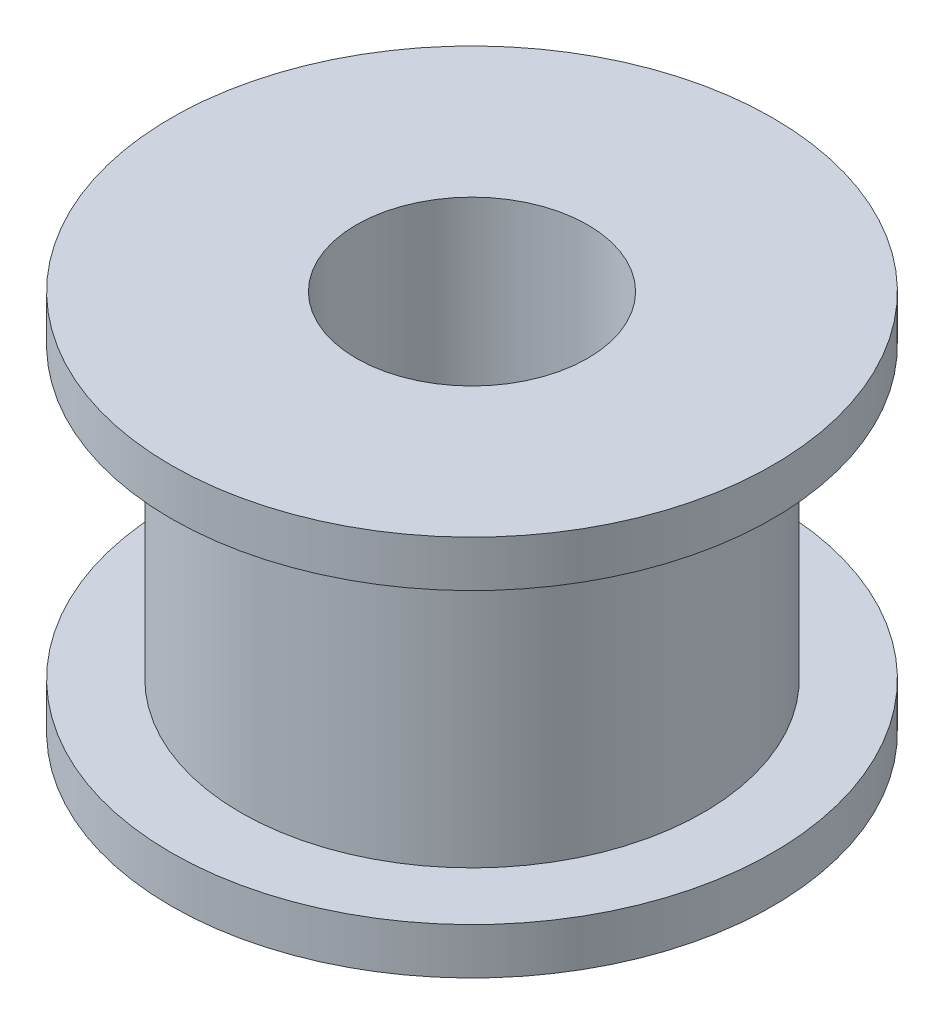
ISO-10303-21;
HEADER;
FILE_DESCRIPTION(('STEP AP214'),'2;1');
FILE_NAME('part.step','',(''),(''),'','','');
FILE_SCHEMA(('AUTOMOTIVE_DESIGN { 1 0 10303 214 1 1 1 1 }'));
ENDSEC;
DATA;
#1=APPLICATION_CONTEXT('core data for automotive mechanical design processes');
#2=APPLICATION_PROTOCOL_DEFINITION('international standard','automotive_design',2000,#1);
#3=PRODUCT_CONTEXT('',#1,'mechanical');
#4=PRODUCT('Part','Part','',(#3));
#5=PRODUCT_RELATED_PRODUCT_CATEGORY('part','',(#4));
#6=PRODUCT_DEFINITION_FORMATION('','',#4);
#7=PRODUCT_DEFINITION_CONTEXT('part definition',#1,'design');
#8=PRODUCT_DEFINITION('design','',#6,#7);
#9=PRODUCT_DEFINITION_SHAPE('','',#8);
#10=(LENGTH_UNIT() NAMED_UNIT(*) SI_UNIT(.MILLI.,.METRE.));
#11=(NAMED_UNIT(*) PLANE_ANGLE_UNIT() SI_UNIT($,.RADIAN.));
#12=(NAMED_UNIT(*) SI_UNIT($,.STERADIAN.) SOLID_ANGLE_UNIT());
#13=UNCERTAINTY_MEASURE_WITH_UNIT(LENGTH_MEASURE(1.E-05),#10,'distance_accuracy_value','');
#14=(GEOMETRIC_REPRESENTATION_CONTEXT(3) GLOBAL_UNCERTAINTY_ASSIGNED_CONTEXT((#13)) GLOBAL_UNIT_ASSIGNED_CONTEXT((#10,
#11,#12)) REPRESENTATION_CONTEXT('',''));
#15=CARTESIAN_POINT('',(0.,0.,0.));
#16=DIRECTION('',(0.,0.,1.));
#17=DIRECTION('',(1.,0.,0.));
#18=AXIS2_PLACEMENT_3D('',#15,#16,#17);
#19=CARTESIAN_POINT('',(-2.5,0.,0.));
#20=DIRECTION('',(0.,1.,0.));
#21=DIRECTION('',(0.,0.,1.));
#22=AXIS2_PLACEMENT_3D('',#19,#20,#21);
#23=PLANE('',#22);
#24=CARTESIAN_POINT('',(0.,0.,0.));
#25=DIRECTION('',(0.,1.,0.));
#26=DIRECTION('',(0.,0.,1.));
#27=AXIS2_PLACEMENT_3D('',#24,#25,#26);
#28=CIRCLE('',#27,6.5);
#29=CARTESIAN_POINT('',(0.,0.,6.5));
#30=VERTEX_POINT('',#29);
#31=EDGE_CURVE('E10',#30,#30,#28,.T.);
#32=ORIENTED_EDGE('',*,*,#31,.T.);
#33=EDGE_LOOP('',(#32));
#34=FACE_BOUND('',#33,.T.);
#35=CARTESIAN_POINT('',(0.,0.,0.));
#36=DIRECTION('',(0.,1.,0.));
#37=DIRECTION('',(0.,0.,1.));
#38=AXIS2_PLACEMENT_3D('',#35,#36,#37);
#39=CIRCLE('',#38,2.5);
#40=CARTESIAN_POINT('',(0.,0.,2.5));
#41=VERTEX_POINT('',#40);
#42=EDGE_CURVE('E62',#41,#41,#39,.T.);
#43=ORIENTED_EDGE('',*,*,#42,.F.);
#44=EDGE_LOOP('',(#43));
#45=FACE_BOUND('',#44,.T.);
#46=ADVANCED_FACE('F34',(#34,#45),#23,.T.);
#47=CARTESIAN_POINT('',(0.,0.,0.));
#48=DIRECTION('',(0.,1.,0.));
#49=DIRECTION('',(0.,0.,1.));
#50=AXIS2_PLACEMENT_3D('',#47,#48,#49);
#51=CYLINDRICAL_SURFACE('',#50,6.5);
#52=CARTESIAN_POINT('',(0.,-1.,0.));
#53=DIRECTION('',(0.,1.,0.));
#54=DIRECTION('',(0.,0.,1.));
#55=AXIS2_PLACEMENT_3D('',#52,#53,#54);
#56=CIRCLE('',#55,6.5);
#57=CARTESIAN_POINT('',(0.,-1.,6.5));
#58=VERTEX_POINT('',#57);
#59=EDGE_CURVE('E40',#58,#58,#56,.T.);
#60=ORIENTED_EDGE('',*,*,#59,.T.);
#61=EDGE_LOOP('',(#60));
#62=FACE_BOUND('',#61,.T.);
#63=ORIENTED_EDGE('',*,*,#31,.F.);
#64=EDGE_LOOP('',(#63));
#65=FACE_BOUND('',#64,.T.);
#66=ADVANCED_FACE('F70',(#62,#65),#51,.T.);
#67=CARTESIAN_POINT('',(-6.5,-1.,0.));
#68=DIRECTION('',(0.,-1.,0.));
#69=DIRECTION('',(0.,0.,-1.));
#70=AXIS2_PLACEMENT_3D('',#67,#68,#69);
#71=PLANE('',#70);
#72=CARTESIAN_POINT('',(0.,-1.,0.));
#73=DIRECTION('',(0.,1.,0.));
#74=DIRECTION('',(0.,0.,1.));
#75=AXIS2_PLACEMENT_3D('',#72,#73,#74);
#76=CIRCLE('',#75,5.);
#77=CARTESIAN_POINT('',(0.,-1.,5.));
#78=VERTEX_POINT('',#77);
#79=EDGE_CURVE('E44',#78,#78,#76,.T.);
#80=ORIENTED_EDGE('',*,*,#79,.T.);
#81=EDGE_LOOP('',(#80));
#82=FACE_BOUND('',#81,.T.);
#83=ORIENTED_EDGE('',*,*,#59,.F.);
#84=EDGE_LOOP('',(#83));
#85=FACE_BOUND('',#84,.T.);
#86=ADVANCED_FACE('F74',(#82,#85),#71,.T.);
#87=CARTESIAN_POINT('',(0.,0.,0.));
#88=DIRECTION('',(0.,1.,0.));
#89=DIRECTION('',(0.,0.,1.));
#90=AXIS2_PLACEMENT_3D('',#87,#88,#89);
#91=CYLINDRICAL_SURFACE('',#90,5.);
#92=CARTESIAN_POINT('',(0.,-7.25,0.));
#93=DIRECTION('',(0.,1.,0.));
#94=DIRECTION('',(0.,0.,1.));
#95=AXIS2_PLACEMENT_3D('',#92,#93,#94);
#96=CIRCLE('',#95,5.);
#97=CARTESIAN_POINT('',(0.,-7.25,5.));
#98=VERTEX_POINT('',#97);
#99=EDGE_CURVE('E48',#98,#98,#96,.T.);
#100=ORIENTED_EDGE('',*,*,#99,.T.);
#101=EDGE_LOOP('',(#100));
#102=FACE_BOUND('',#101,.T.);
#103=ORIENTED_EDGE('',*,*,#79,.F.);
#104=EDGE_LOOP('',(#103));
#105=FACE_BOUND('',#104,.T.);
#106=ADVANCED_FACE('F78',(#102,#105),#91,.T.);
#107=CARTESIAN_POINT('',(-5.,-7.25,0.));
#108=DIRECTION('',(0.,1.,0.));
#109=DIRECTION('',(0.,0.,1.));
#110=AXIS2_PLACEMENT_3D('',#107,#108,#109);
#111=PLANE('',#110);
#112=CARTESIAN_POINT('',(0.,-7.25,0.));
#113=DIRECTION('',(0.,1.,0.));
#114=DIRECTION('',(0.,0.,1.));
#115=AXIS2_PLACEMENT_3D('',#112,#113,#114);
#116=CIRCLE('',#115,6.5);
#117=CARTESIAN_POINT('',(0.,-7.25,6.5));
#118=VERTEX_POINT('',#117);
#119=EDGE_CURVE('E53',#118,#118,#116,.T.);
#120=ORIENTED_EDGE('',*,*,#119,.T.);
#121=EDGE_LOOP('',(#120));
#122=FACE_BOUND('',#121,.T.);
#123=ORIENTED_EDGE('',*,*,#99,.F.);
#124=EDGE_LOOP('',(#123));
#125=FACE_BOUND('',#124,.T.);
#126=ADVANCED_FACE('F85',(#122,#125),#111,.T.);
#127=CARTESIAN_POINT('',(0.,0.,0.));
#128=DIRECTION('',(0.,1.,0.));
#129=DIRECTION('',(0.,0.,1.));
#130=AXIS2_PLACEMENT_3D('',#127,#128,#129);
#131=CYLINDRICAL_SURFACE('',#130,6.5);
#132=CARTESIAN_POINT('',(0.,-8.25,0.));
#133=DIRECTION('',(0.,1.,0.));
#134=DIRECTION('',(0.,0.,1.));
#135=AXIS2_PLACEMENT_3D('',#132,#133,#134);
#136=CIRCLE('',#135,6.5);
#137=CARTESIAN_POINT('',(0.,-8.25,6.5));
#138=VERTEX_POINT('',#137);
#139=EDGE_CURVE('E56',#138,#138,#136,.T.);
#140=ORIENTED_EDGE('',*,*,#139,.T.);
#141=EDGE_LOOP('',(#140));
#142=FACE_BOUND('',#141,.T.);
#143=ORIENTED_EDGE('',*,*,#119,.F.);
#144=EDGE_LOOP('',(#143));
#145=FACE_BOUND('',#144,.T.);
#146=ADVANCED_FACE('F89',(#142,#145),#131,.T.);
#147=CARTESIAN_POINT('',(-6.5,-8.25,0.));
#148=DIRECTION('',(0.,-1.,0.));
#149=DIRECTION('',(0.,0.,-1.));
#150=AXIS2_PLACEMENT_3D('',#147,#148,#149);
#151=PLANE('',#150);
#152=CARTESIAN_POINT('',(0.,-8.25,0.));
#153=DIRECTION('',(0.,1.,0.));
#154=DIRECTION('',(0.,0.,1.));
#155=AXIS2_PLACEMENT_3D('',#152,#153,#154);
#156=CIRCLE('',#155,2.5);
#157=CARTESIAN_POINT('',(0.,-8.25,2.5));
#158=VERTEX_POINT('',#157);
#159=EDGE_CURVE('E59',#158,#158,#156,.T.);
#160=ORIENTED_EDGE('',*,*,#159,.T.);
#161=EDGE_LOOP('',(#160));
#162=FACE_BOUND('',#161,.T.);
#163=ORIENTED_EDGE('',*,*,#139,.F.);
#164=EDGE_LOOP('',(#163));
#165=FACE_BOUND('',#164,.T.);
#166=ADVANCED_FACE('F93',(#162,#165),#151,.T.);
#167=CARTESIAN_POINT('',(0.,0.,0.));
#168=DIRECTION('',(0.,1.,0.));
#169=DIRECTION('',(0.,0.,1.));
#170=AXIS2_PLACEMENT_3D('',#167,#168,#169);
#171=CYLINDRICAL_SURFACE('',#170,2.5);
#172=ORIENTED_EDGE('',*,*,#42,.T.);
#173=EDGE_LOOP('',(#172));
#174=FACE_BOUND('',#173,.T.);
#175=ORIENTED_EDGE('',*,*,#159,.F.);
#176=EDGE_LOOP('',(#175));
#177=FACE_BOUND('',#176,.T.);
#178=ADVANCED_FACE('F66',(#174,#177),#171,.F.);
#179=CLOSED_SHELL('',(#46,#66,#86,#106,#126,#146,#166,#178));
#180=MANIFOLD_SOLID_BREP('B2',#179);
#181=ADVANCED_BREP_SHAPE_REPRESENTATION('',(#18,#180),#14);
#182=SHAPE_DEFINITION_REPRESENTATION(#9,#181);
ENDSEC;
END-ISO-10303-21;
